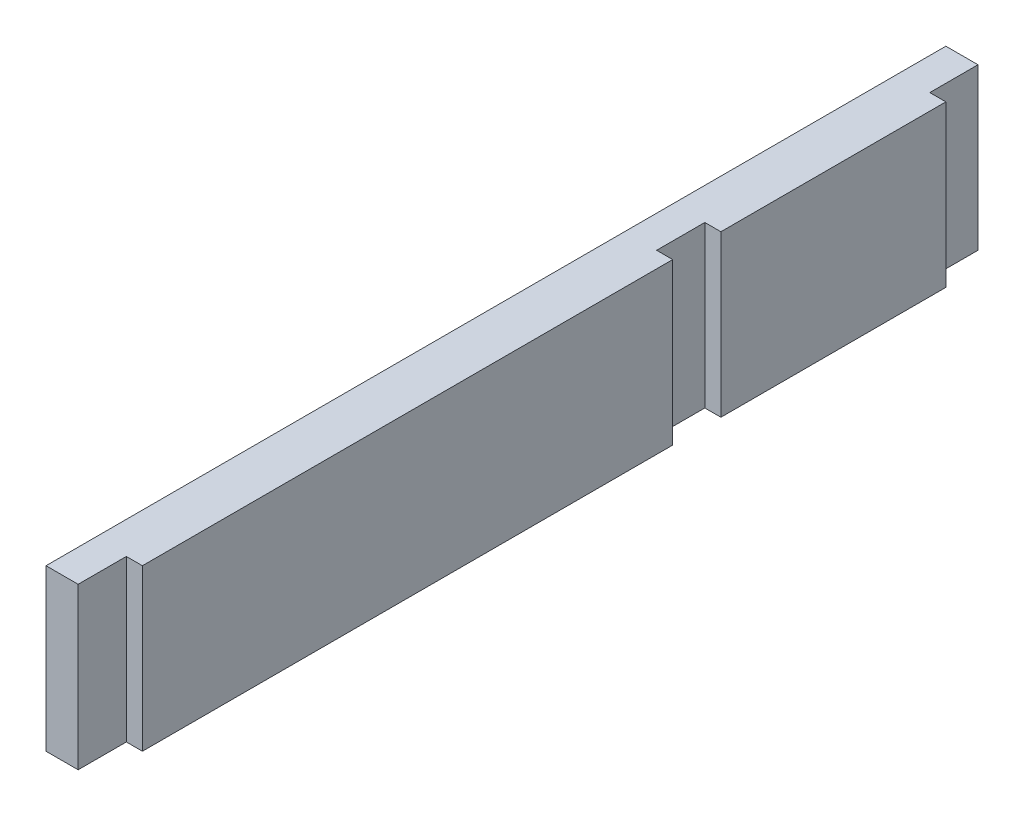
ISO-10303-21;
HEADER;
FILE_DESCRIPTION(('STEP AP214'),'2;1');
FILE_NAME('part.step','',(''),(''),'','','');
FILE_SCHEMA(('AUTOMOTIVE_DESIGN { 1 0 10303 214 1 1 1 1 }'));
ENDSEC;
DATA;
#1=APPLICATION_CONTEXT('core data for automotive mechanical design processes');
#2=APPLICATION_PROTOCOL_DEFINITION('international standard','automotive_design',2000,#1);
#3=PRODUCT_CONTEXT('',#1,'mechanical');
#4=PRODUCT('Part','Part','',(#3));
#5=PRODUCT_RELATED_PRODUCT_CATEGORY('part','',(#4));
#6=PRODUCT_DEFINITION_FORMATION('','',#4);
#7=PRODUCT_DEFINITION_CONTEXT('part definition',#1,'design');
#8=PRODUCT_DEFINITION('design','',#6,#7);
#9=PRODUCT_DEFINITION_SHAPE('','',#8);
#10=(LENGTH_UNIT() NAMED_UNIT(*) SI_UNIT(.MILLI.,.METRE.));
#11=(NAMED_UNIT(*) PLANE_ANGLE_UNIT() SI_UNIT($,.RADIAN.));
#12=(NAMED_UNIT(*) SI_UNIT($,.STERADIAN.) SOLID_ANGLE_UNIT());
#13=UNCERTAINTY_MEASURE_WITH_UNIT(LENGTH_MEASURE(1.E-05),#10,'distance_accuracy_value','');
#14=(GEOMETRIC_REPRESENTATION_CONTEXT(3) GLOBAL_UNCERTAINTY_ASSIGNED_CONTEXT((#13)) GLOBAL_UNIT_ASSIGNED_CONTEXT((#10,
#11,#12)) REPRESENTATION_CONTEXT('',''));
#15=CARTESIAN_POINT('',(0.,0.,0.));
#16=DIRECTION('',(0.,0.,1.));
#17=DIRECTION('',(1.,0.,0.));
#18=AXIS2_PLACEMENT_3D('',#15,#16,#17);
#19=CARTESIAN_POINT('',(-171.45,15.875,-88.9));
#20=DIRECTION('',(0.,0.,1.));
#21=DIRECTION('',(1.,0.,0.));
#22=AXIS2_PLACEMENT_3D('',#19,#20,#21);
#23=PLANE('',#22);
#24=DIRECTION('',(0.,-1.,0.));
#25=VECTOR('',#24,1.);
#26=CARTESIAN_POINT('',(-165.1,15.875,-88.9));
#27=LINE('',#26,#25);
#28=CARTESIAN_POINT('',(-165.1,15.875,-88.9));
#29=VERTEX_POINT('',#28);
#30=CARTESIAN_POINT('',(-165.1,-15.875,-88.9));
#31=VERTEX_POINT('',#30);
#32=EDGE_CURVE('E140',#29,#31,#27,.T.);
#33=ORIENTED_EDGE('',*,*,#32,.T.);
#34=DIRECTION('',(-1.,0.,0.));
#35=VECTOR('',#34,1.);
#36=CARTESIAN_POINT('',(-171.45,-15.875,-88.9));
#37=LINE('',#36,#35);
#38=CARTESIAN_POINT('',(-171.45,-15.875,-88.9));
#39=VERTEX_POINT('',#38);
#40=EDGE_CURVE('E134',#31,#39,#37,.T.);
#41=ORIENTED_EDGE('',*,*,#40,.T.);
#42=DIRECTION('',(0.,-1.,0.));
#43=VECTOR('',#42,1.);
#44=CARTESIAN_POINT('',(-171.45,15.875,-88.9));
#45=LINE('',#44,#43);
#46=CARTESIAN_POINT('',(-171.45,15.875,-88.9));
#47=VERTEX_POINT('',#46);
#48=EDGE_CURVE('E11',#47,#39,#45,.T.);
#49=ORIENTED_EDGE('',*,*,#48,.F.);
#50=DIRECTION('',(-1.,0.,0.));
#51=VECTOR('',#50,1.);
#52=CARTESIAN_POINT('',(-171.45,15.875,-88.9));
#53=LINE('',#52,#51);
#54=EDGE_CURVE('E170',#29,#47,#53,.T.);
#55=ORIENTED_EDGE('',*,*,#54,.F.);
#56=EDGE_LOOP('',(#33,#41,#49,#55));
#57=FACE_BOUND('',#56,.T.);
#58=ADVANCED_FACE('F34',(#57),#23,.F.);
#59=CARTESIAN_POINT('',(-171.45,15.875,-88.9));
#60=DIRECTION('',(1.,0.,0.));
#61=DIRECTION('',(0.,0.,-1.));
#62=AXIS2_PLACEMENT_3D('',#59,#60,#61);
#63=PLANE('',#62);
#64=ORIENTED_EDGE('',*,*,#48,.T.);
#65=DIRECTION('',(0.,0.,1.));
#66=VECTOR('',#65,1.);
#67=CARTESIAN_POINT('',(-171.45,-15.875,-88.9));
#68=LINE('',#67,#66);
#69=CARTESIAN_POINT('',(-171.45,-15.875,88.9));
#70=VERTEX_POINT('',#69);
#71=EDGE_CURVE('E124',#39,#70,#68,.T.);
#72=ORIENTED_EDGE('',*,*,#71,.T.);
#73=DIRECTION('',(0.,-1.,0.));
#74=VECTOR('',#73,1.);
#75=CARTESIAN_POINT('',(-171.45,15.875,88.9));
#76=LINE('',#75,#74);
#77=CARTESIAN_POINT('',(-171.45,15.875,88.9));
#78=VERTEX_POINT('',#77);
#79=EDGE_CURVE('E41',#78,#70,#76,.T.);
#80=ORIENTED_EDGE('',*,*,#79,.F.);
#81=DIRECTION('',(0.,0.,1.));
#82=VECTOR('',#81,1.);
#83=CARTESIAN_POINT('',(-171.45,15.875,-88.9));
#84=LINE('',#83,#82);
#85=EDGE_CURVE('E125',#47,#78,#84,.T.);
#86=ORIENTED_EDGE('',*,*,#85,.F.);
#87=EDGE_LOOP('',(#64,#72,#80,#86));
#88=FACE_BOUND('',#87,.T.);
#89=ADVANCED_FACE('F122',(#88),#63,.F.);
#90=CARTESIAN_POINT('',(-165.1,15.875,88.9));
#91=DIRECTION('',(0.,0.,-1.));
#92=DIRECTION('',(-1.,0.,0.));
#93=AXIS2_PLACEMENT_3D('',#90,#91,#92);
#94=PLANE('',#93);
#95=ORIENTED_EDGE('',*,*,#79,.T.);
#96=DIRECTION('',(1.,0.,0.));
#97=VECTOR('',#96,1.);
#98=CARTESIAN_POINT('',(-165.1,-15.875,88.9));
#99=LINE('',#98,#97);
#100=CARTESIAN_POINT('',(-165.1,-15.875,88.9));
#101=VERTEX_POINT('',#100);
#102=EDGE_CURVE('E138',#70,#101,#99,.T.);
#103=ORIENTED_EDGE('',*,*,#102,.T.);
#104=DIRECTION('',(0.,-1.,0.));
#105=VECTOR('',#104,1.);
#106=CARTESIAN_POINT('',(-165.1,15.875,88.9));
#107=LINE('',#106,#105);
#108=CARTESIAN_POINT('',(-165.1,15.875,88.9));
#109=VERTEX_POINT('',#108);
#110=EDGE_CURVE('E208',#109,#101,#107,.T.);
#111=ORIENTED_EDGE('',*,*,#110,.F.);
#112=DIRECTION('',(1.,0.,0.));
#113=VECTOR('',#112,1.);
#114=CARTESIAN_POINT('',(-165.1,15.875,88.9));
#115=LINE('',#114,#113);
#116=EDGE_CURVE('E173',#78,#109,#115,.T.);
#117=ORIENTED_EDGE('',*,*,#116,.F.);
#118=EDGE_LOOP('',(#95,#103,#111,#117));
#119=FACE_BOUND('',#118,.T.);
#120=ADVANCED_FACE('F211',(#119),#94,.F.);
#121=CARTESIAN_POINT('',(-165.1,15.875,79.375));
#122=DIRECTION('',(-1.,0.,0.));
#123=DIRECTION('',(0.,0.,1.));
#124=AXIS2_PLACEMENT_3D('',#121,#122,#123);
#125=PLANE('',#124);
#126=ORIENTED_EDGE('',*,*,#110,.T.);
#127=DIRECTION('',(0.,0.,-1.));
#128=VECTOR('',#127,1.);
#129=CARTESIAN_POINT('',(-165.1,-15.875,79.375));
#130=LINE('',#129,#128);
#131=CARTESIAN_POINT('',(-165.1,-15.875,79.375));
#132=VERTEX_POINT('',#131);
#133=EDGE_CURVE('E144',#101,#132,#130,.T.);
#134=ORIENTED_EDGE('',*,*,#133,.T.);
#135=DIRECTION('',(0.,-1.,0.));
#136=VECTOR('',#135,1.);
#137=CARTESIAN_POINT('',(-165.1,15.875,79.375));
#138=LINE('',#137,#136);
#139=CARTESIAN_POINT('',(-165.1,15.875,79.375));
#140=VERTEX_POINT('',#139);
#141=EDGE_CURVE('E206',#140,#132,#138,.T.);
#142=ORIENTED_EDGE('',*,*,#141,.F.);
#143=DIRECTION('',(0.,0.,-1.));
#144=VECTOR('',#143,1.);
#145=CARTESIAN_POINT('',(-165.1,15.875,79.375));
#146=LINE('',#145,#144);
#147=EDGE_CURVE('E175',#109,#140,#146,.T.);
#148=ORIENTED_EDGE('',*,*,#147,.F.);
#149=EDGE_LOOP('',(#126,#134,#142,#148));
#150=FACE_BOUND('',#149,.T.);
#151=ADVANCED_FACE('F219',(#150),#125,.F.);
#152=CARTESIAN_POINT('',(-161.925,15.875,79.375));
#153=DIRECTION('',(0.,0.,-1.));
#154=DIRECTION('',(-1.,0.,0.));
#155=AXIS2_PLACEMENT_3D('',#152,#153,#154);
#156=PLANE('',#155);
#157=ORIENTED_EDGE('',*,*,#141,.T.);
#158=DIRECTION('',(1.,0.,0.));
#159=VECTOR('',#158,1.);
#160=CARTESIAN_POINT('',(-161.925,-15.875,79.375));
#161=LINE('',#160,#159);
#162=CARTESIAN_POINT('',(-161.925,-15.875,79.375));
#163=VERTEX_POINT('',#162);
#164=EDGE_CURVE('E147',#132,#163,#161,.T.);
#165=ORIENTED_EDGE('',*,*,#164,.T.);
#166=DIRECTION('',(0.,-1.,0.));
#167=VECTOR('',#166,1.);
#168=CARTESIAN_POINT('',(-161.925,15.875,79.375));
#169=LINE('',#168,#167);
#170=CARTESIAN_POINT('',(-161.925,15.875,79.375));
#171=VERTEX_POINT('',#170);
#172=EDGE_CURVE('E204',#171,#163,#169,.T.);
#173=ORIENTED_EDGE('',*,*,#172,.F.);
#174=DIRECTION('',(1.,0.,0.));
#175=VECTOR('',#174,1.);
#176=CARTESIAN_POINT('',(-161.925,15.875,79.375));
#177=LINE('',#176,#175);
#178=EDGE_CURVE('E177',#140,#171,#177,.T.);
#179=ORIENTED_EDGE('',*,*,#178,.F.);
#180=EDGE_LOOP('',(#157,#165,#173,#179));
#181=FACE_BOUND('',#180,.T.);
#182=ADVANCED_FACE('F222',(#181),#156,.F.);
#183=CARTESIAN_POINT('',(-161.925,15.875,-25.4));
#184=DIRECTION('',(-1.,0.,0.));
#185=DIRECTION('',(0.,0.,1.));
#186=AXIS2_PLACEMENT_3D('',#183,#184,#185);
#187=PLANE('',#186);
#188=ORIENTED_EDGE('',*,*,#172,.T.);
#189=DIRECTION('',(0.,0.,-1.));
#190=VECTOR('',#189,1.);
#191=CARTESIAN_POINT('',(-161.925,-15.875,-25.4));
#192=LINE('',#191,#190);
#193=CARTESIAN_POINT('',(-161.925,-15.875,-25.4));
#194=VERTEX_POINT('',#193);
#195=EDGE_CURVE('E150',#163,#194,#192,.T.);
#196=ORIENTED_EDGE('',*,*,#195,.T.);
#197=DIRECTION('',(0.,-1.,0.));
#198=VECTOR('',#197,1.);
#199=CARTESIAN_POINT('',(-161.925,15.875,-25.4));
#200=LINE('',#199,#198);
#201=CARTESIAN_POINT('',(-161.925,15.875,-25.4));
#202=VERTEX_POINT('',#201);
#203=EDGE_CURVE('E202',#202,#194,#200,.T.);
#204=ORIENTED_EDGE('',*,*,#203,.F.);
#205=DIRECTION('',(0.,0.,-1.));
#206=VECTOR('',#205,1.);
#207=CARTESIAN_POINT('',(-161.925,15.875,-25.4));
#208=LINE('',#207,#206);
#209=EDGE_CURVE('E179',#171,#202,#208,.T.);
#210=ORIENTED_EDGE('',*,*,#209,.F.);
#211=EDGE_LOOP('',(#188,#196,#204,#210));
#212=FACE_BOUND('',#211,.T.);
#213=ADVANCED_FACE('F227',(#212),#187,.F.);
#214=CARTESIAN_POINT('',(-165.1,15.875,-25.4));
#215=DIRECTION('',(0.,0.,1.));
#216=DIRECTION('',(1.,0.,0.));
#217=AXIS2_PLACEMENT_3D('',#214,#215,#216);
#218=PLANE('',#217);
#219=ORIENTED_EDGE('',*,*,#203,.T.);
#220=DIRECTION('',(-1.,0.,0.));
#221=VECTOR('',#220,1.);
#222=CARTESIAN_POINT('',(-165.1,-15.875,-25.4));
#223=LINE('',#222,#221);
#224=CARTESIAN_POINT('',(-165.1,-15.875,-25.4));
#225=VERTEX_POINT('',#224);
#226=EDGE_CURVE('E153',#194,#225,#223,.T.);
#227=ORIENTED_EDGE('',*,*,#226,.T.);
#228=DIRECTION('',(0.,-1.,0.));
#229=VECTOR('',#228,1.);
#230=CARTESIAN_POINT('',(-165.1,15.875,-25.4));
#231=LINE('',#230,#229);
#232=CARTESIAN_POINT('',(-165.1,15.875,-25.4));
#233=VERTEX_POINT('',#232);
#234=EDGE_CURVE('E200',#233,#225,#231,.T.);
#235=ORIENTED_EDGE('',*,*,#234,.F.);
#236=DIRECTION('',(-1.,0.,0.));
#237=VECTOR('',#236,1.);
#238=CARTESIAN_POINT('',(-165.1,15.875,-25.4));
#239=LINE('',#238,#237);
#240=EDGE_CURVE('E181',#202,#233,#239,.T.);
#241=ORIENTED_EDGE('',*,*,#240,.F.);
#242=EDGE_LOOP('',(#219,#227,#235,#241));
#243=FACE_BOUND('',#242,.T.);
#244=ADVANCED_FACE('F233',(#243),#218,.F.);
#245=CARTESIAN_POINT('',(-165.1,15.875,-34.925));
#246=DIRECTION('',(-1.,0.,0.));
#247=DIRECTION('',(0.,0.,1.));
#248=AXIS2_PLACEMENT_3D('',#245,#246,#247);
#249=PLANE('',#248);
#250=ORIENTED_EDGE('',*,*,#234,.T.);
#251=DIRECTION('',(0.,0.,-1.));
#252=VECTOR('',#251,1.);
#253=CARTESIAN_POINT('',(-165.1,-15.875,-34.925));
#254=LINE('',#253,#252);
#255=CARTESIAN_POINT('',(-165.1,-15.875,-34.925));
#256=VERTEX_POINT('',#255);
#257=EDGE_CURVE('E156',#225,#256,#254,.T.);
#258=ORIENTED_EDGE('',*,*,#257,.T.);
#259=DIRECTION('',(0.,-1.,0.));
#260=VECTOR('',#259,1.);
#261=CARTESIAN_POINT('',(-165.1,15.875,-34.925));
#262=LINE('',#261,#260);
#263=CARTESIAN_POINT('',(-165.1,15.875,-34.925));
#264=VERTEX_POINT('',#263);
#265=EDGE_CURVE('E198',#264,#256,#262,.T.);
#266=ORIENTED_EDGE('',*,*,#265,.F.);
#267=DIRECTION('',(0.,0.,-1.));
#268=VECTOR('',#267,1.);
#269=CARTESIAN_POINT('',(-165.1,15.875,-34.925));
#270=LINE('',#269,#268);
#271=EDGE_CURVE('E183',#233,#264,#270,.T.);
#272=ORIENTED_EDGE('',*,*,#271,.F.);
#273=EDGE_LOOP('',(#250,#258,#266,#272));
#274=FACE_BOUND('',#273,.T.);
#275=ADVANCED_FACE('F237',(#274),#249,.F.);
#276=CARTESIAN_POINT('',(-161.925,15.875,-34.925));
#277=DIRECTION('',(0.,0.,-1.));
#278=DIRECTION('',(-1.,0.,0.));
#279=AXIS2_PLACEMENT_3D('',#276,#277,#278);
#280=PLANE('',#279);
#281=ORIENTED_EDGE('',*,*,#265,.T.);
#282=DIRECTION('',(1.,0.,0.));
#283=VECTOR('',#282,1.);
#284=CARTESIAN_POINT('',(-161.925,-15.875,-34.925));
#285=LINE('',#284,#283);
#286=CARTESIAN_POINT('',(-161.925,-15.875,-34.925));
#287=VERTEX_POINT('',#286);
#288=EDGE_CURVE('E159',#256,#287,#285,.T.);
#289=ORIENTED_EDGE('',*,*,#288,.T.);
#290=DIRECTION('',(0.,-1.,0.));
#291=VECTOR('',#290,1.);
#292=CARTESIAN_POINT('',(-161.925,15.875,-34.925));
#293=LINE('',#292,#291);
#294=CARTESIAN_POINT('',(-161.925,15.875,-34.925));
#295=VERTEX_POINT('',#294);
#296=EDGE_CURVE('E196',#295,#287,#293,.T.);
#297=ORIENTED_EDGE('',*,*,#296,.F.);
#298=DIRECTION('',(1.,0.,0.));
#299=VECTOR('',#298,1.);
#300=CARTESIAN_POINT('',(-161.925,15.875,-34.925));
#301=LINE('',#300,#299);
#302=EDGE_CURVE('E185',#264,#295,#301,.T.);
#303=ORIENTED_EDGE('',*,*,#302,.F.);
#304=EDGE_LOOP('',(#281,#289,#297,#303));
#305=FACE_BOUND('',#304,.T.);
#306=ADVANCED_FACE('F242',(#305),#280,.F.);
#307=CARTESIAN_POINT('',(-161.925,15.875,-79.375));
#308=DIRECTION('',(-1.,0.,0.));
#309=DIRECTION('',(0.,0.,1.));
#310=AXIS2_PLACEMENT_3D('',#307,#308,#309);
#311=PLANE('',#310);
#312=ORIENTED_EDGE('',*,*,#296,.T.);
#313=DIRECTION('',(0.,0.,-1.));
#314=VECTOR('',#313,1.);
#315=CARTESIAN_POINT('',(-161.925,-15.875,-79.375));
#316=LINE('',#315,#314);
#317=CARTESIAN_POINT('',(-161.925,-15.875,-79.375));
#318=VERTEX_POINT('',#317);
#319=EDGE_CURVE('E162',#287,#318,#316,.T.);
#320=ORIENTED_EDGE('',*,*,#319,.T.);
#321=DIRECTION('',(0.,-1.,0.));
#322=VECTOR('',#321,1.);
#323=CARTESIAN_POINT('',(-161.925,15.875,-79.375));
#324=LINE('',#323,#322);
#325=CARTESIAN_POINT('',(-161.925,15.875,-79.375));
#326=VERTEX_POINT('',#325);
#327=EDGE_CURVE('E194',#326,#318,#324,.T.);
#328=ORIENTED_EDGE('',*,*,#327,.F.);
#329=DIRECTION('',(0.,0.,-1.));
#330=VECTOR('',#329,1.);
#331=CARTESIAN_POINT('',(-161.925,15.875,-79.375));
#332=LINE('',#331,#330);
#333=EDGE_CURVE('E187',#295,#326,#332,.T.);
#334=ORIENTED_EDGE('',*,*,#333,.F.);
#335=EDGE_LOOP('',(#312,#320,#328,#334));
#336=FACE_BOUND('',#335,.T.);
#337=ADVANCED_FACE('F246',(#336),#311,.F.);
#338=CARTESIAN_POINT('',(-165.1,15.875,-79.375));
#339=DIRECTION('',(0.,0.,1.));
#340=DIRECTION('',(1.,0.,0.));
#341=AXIS2_PLACEMENT_3D('',#338,#339,#340);
#342=PLANE('',#341);
#343=ORIENTED_EDGE('',*,*,#327,.T.);
#344=DIRECTION('',(-1.,0.,0.));
#345=VECTOR('',#344,1.);
#346=CARTESIAN_POINT('',(-165.1,-15.875,-79.375));
#347=LINE('',#346,#345);
#348=CARTESIAN_POINT('',(-165.1,-15.875,-79.375));
#349=VERTEX_POINT('',#348);
#350=EDGE_CURVE('E165',#318,#349,#347,.T.);
#351=ORIENTED_EDGE('',*,*,#350,.T.);
#352=DIRECTION('',(0.,-1.,0.));
#353=VECTOR('',#352,1.);
#354=CARTESIAN_POINT('',(-165.1,15.875,-79.375));
#355=LINE('',#354,#353);
#356=CARTESIAN_POINT('',(-165.1,15.875,-79.375));
#357=VERTEX_POINT('',#356);
#358=EDGE_CURVE('E192',#357,#349,#355,.T.);
#359=ORIENTED_EDGE('',*,*,#358,.F.);
#360=DIRECTION('',(-1.,0.,0.));
#361=VECTOR('',#360,1.);
#362=CARTESIAN_POINT('',(-165.1,15.875,-79.375));
#363=LINE('',#362,#361);
#364=EDGE_CURVE('E53',#326,#357,#363,.T.);
#365=ORIENTED_EDGE('',*,*,#364,.F.);
#366=EDGE_LOOP('',(#343,#351,#359,#365));
#367=FACE_BOUND('',#366,.T.);
#368=ADVANCED_FACE('F250',(#367),#342,.F.);
#369=CARTESIAN_POINT('',(-165.1,15.875,-88.9));
#370=DIRECTION('',(-1.,0.,0.));
#371=DIRECTION('',(0.,0.,1.));
#372=AXIS2_PLACEMENT_3D('',#369,#370,#371);
#373=PLANE('',#372);
#374=ORIENTED_EDGE('',*,*,#358,.T.);
#375=DIRECTION('',(0.,0.,-1.));
#376=VECTOR('',#375,1.);
#377=CARTESIAN_POINT('',(-165.1,-15.875,-88.9));
#378=LINE('',#377,#376);
#379=EDGE_CURVE('E168',#349,#31,#378,.T.);
#380=ORIENTED_EDGE('',*,*,#379,.T.);
#381=ORIENTED_EDGE('',*,*,#32,.F.);
#382=DIRECTION('',(0.,0.,-1.));
#383=VECTOR('',#382,1.);
#384=CARTESIAN_POINT('',(-165.1,15.875,-88.9));
#385=LINE('',#384,#383);
#386=EDGE_CURVE('E48',#357,#29,#385,.T.);
#387=ORIENTED_EDGE('',*,*,#386,.F.);
#388=EDGE_LOOP('',(#374,#380,#381,#387));
#389=FACE_BOUND('',#388,.T.);
#390=ADVANCED_FACE('F252',(#389),#373,.F.);
#391=CARTESIAN_POINT('',(-165.1,15.875,-88.9));
#392=DIRECTION('',(0.,-1.,0.));
#393=DIRECTION('',(0.,0.,-1.));
#394=AXIS2_PLACEMENT_3D('',#391,#392,#393);
#395=PLANE('',#394);
#396=ORIENTED_EDGE('',*,*,#54,.T.);
#397=ORIENTED_EDGE('',*,*,#85,.T.);
#398=ORIENTED_EDGE('',*,*,#116,.T.);
#399=ORIENTED_EDGE('',*,*,#147,.T.);
#400=ORIENTED_EDGE('',*,*,#178,.T.);
#401=ORIENTED_EDGE('',*,*,#209,.T.);
#402=ORIENTED_EDGE('',*,*,#240,.T.);
#403=ORIENTED_EDGE('',*,*,#271,.T.);
#404=ORIENTED_EDGE('',*,*,#302,.T.);
#405=ORIENTED_EDGE('',*,*,#333,.T.);
#406=ORIENTED_EDGE('',*,*,#364,.T.);
#407=ORIENTED_EDGE('',*,*,#386,.T.);
#408=EDGE_LOOP('',(#396,#397,#398,#399,#400,#401,#402,#403,#404,#405,#406,#407));
#409=FACE_BOUND('',#408,.T.);
#410=ADVANCED_FACE('F214',(#409),#395,.F.);
#411=CARTESIAN_POINT('',(-165.1,-15.875,-88.9));
#412=DIRECTION('',(0.,-1.,0.));
#413=DIRECTION('',(0.,0.,-1.));
#414=AXIS2_PLACEMENT_3D('',#411,#412,#413);
#415=PLANE('',#414);
#416=ORIENTED_EDGE('',*,*,#40,.F.);
#417=ORIENTED_EDGE('',*,*,#379,.F.);
#418=ORIENTED_EDGE('',*,*,#350,.F.);
#419=ORIENTED_EDGE('',*,*,#319,.F.);
#420=ORIENTED_EDGE('',*,*,#288,.F.);
#421=ORIENTED_EDGE('',*,*,#257,.F.);
#422=ORIENTED_EDGE('',*,*,#226,.F.);
#423=ORIENTED_EDGE('',*,*,#195,.F.);
#424=ORIENTED_EDGE('',*,*,#164,.F.);
#425=ORIENTED_EDGE('',*,*,#133,.F.);
#426=ORIENTED_EDGE('',*,*,#102,.F.);
#427=ORIENTED_EDGE('',*,*,#71,.F.);
#428=EDGE_LOOP('',(#416,#417,#418,#419,#420,#421,#422,#423,#424,#425,#426,#427));
#429=FACE_BOUND('',#428,.T.);
#430=ADVANCED_FACE('F132',(#429),#415,.T.);
#431=CLOSED_SHELL('',(#58,#89,#120,#151,#182,#213,#244,#275,#306,#337,#368,#390,#410,#430));
#432=MANIFOLD_SOLID_BREP('B2',#431);
#433=ADVANCED_BREP_SHAPE_REPRESENTATION('',(#18,#432),#14);
#434=SHAPE_DEFINITION_REPRESENTATION(#9,#433);
ENDSEC;
END-ISO-10303-21;
